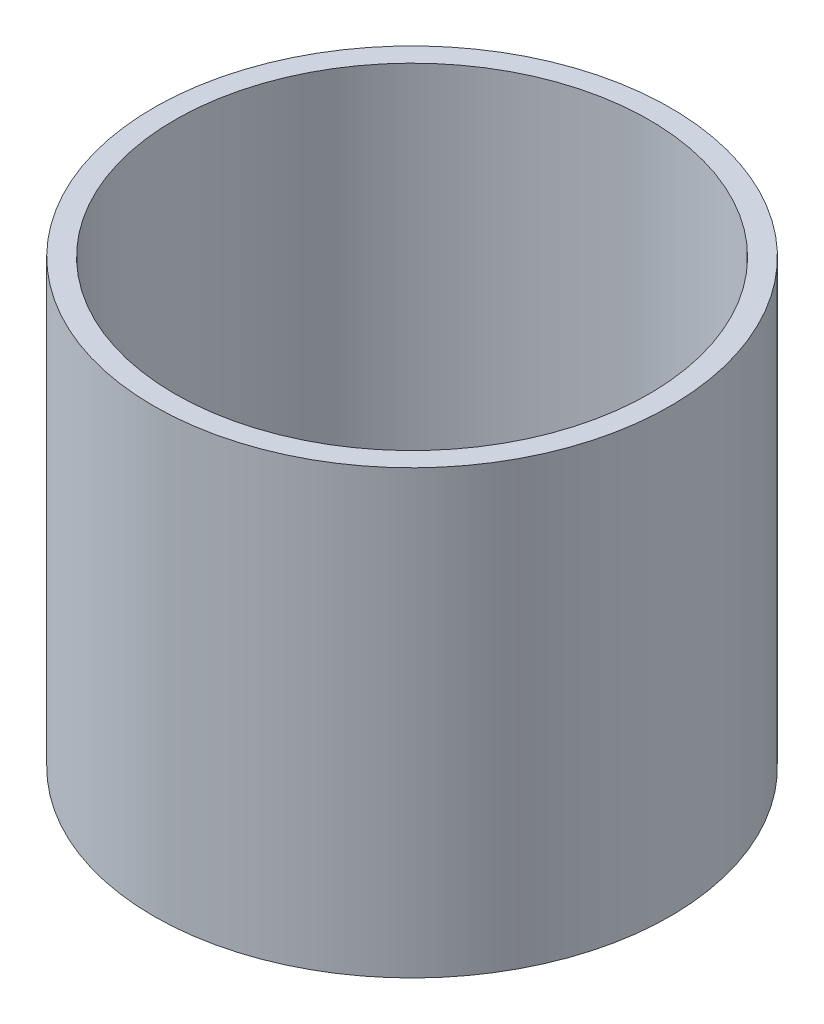
ISO-10303-21;
HEADER;
FILE_DESCRIPTION(('STEP AP214'),'2;1');
FILE_NAME('part.step','',(''),(''),'','','');
FILE_SCHEMA(('AUTOMOTIVE_DESIGN { 1 0 10303 214 1 1 1 1 }'));
ENDSEC;
DATA;
#1=APPLICATION_CONTEXT('core data for automotive mechanical design processes');
#2=APPLICATION_PROTOCOL_DEFINITION('international standard','automotive_design',2000,#1);
#3=PRODUCT_CONTEXT('',#1,'mechanical');
#4=PRODUCT('Part','Part','',(#3));
#5=PRODUCT_RELATED_PRODUCT_CATEGORY('part','',(#4));
#6=PRODUCT_DEFINITION_FORMATION('','',#4);
#7=PRODUCT_DEFINITION_CONTEXT('part definition',#1,'design');
#8=PRODUCT_DEFINITION('design','',#6,#7);
#9=PRODUCT_DEFINITION_SHAPE('','',#8);
#10=(LENGTH_UNIT() NAMED_UNIT(*) SI_UNIT(.MILLI.,.METRE.));
#11=(NAMED_UNIT(*) PLANE_ANGLE_UNIT() SI_UNIT($,.RADIAN.));
#12=(NAMED_UNIT(*) SI_UNIT($,.STERADIAN.) SOLID_ANGLE_UNIT());
#13=UNCERTAINTY_MEASURE_WITH_UNIT(LENGTH_MEASURE(1.E-05),#10,'distance_accuracy_value','');
#14=(GEOMETRIC_REPRESENTATION_CONTEXT(3) GLOBAL_UNCERTAINTY_ASSIGNED_CONTEXT((#13)) GLOBAL_UNIT_ASSIGNED_CONTEXT((#10,
#11,#12)) REPRESENTATION_CONTEXT('',''));
#15=CARTESIAN_POINT('',(0.,0.,0.));
#16=DIRECTION('',(0.,0.,1.));
#17=DIRECTION('',(1.,0.,0.));
#18=AXIS2_PLACEMENT_3D('',#15,#16,#17);
#19=CARTESIAN_POINT('',(0.,41.9,0.));
#20=DIRECTION('',(0.,1.,0.));
#21=DIRECTION('',(0.,0.,1.));
#22=AXIS2_PLACEMENT_3D('',#19,#20,#21);
#23=PLANE('',#22);
#24=CARTESIAN_POINT('',(0.,41.9,0.));
#25=DIRECTION('',(0.,1.,0.));
#26=DIRECTION('',(0.,0.,1.));
#27=AXIS2_PLACEMENT_3D('',#24,#25,#26);
#28=CIRCLE('',#27,24.5);
#29=CARTESIAN_POINT('',(0.,41.9,24.5));
#30=VERTEX_POINT('',#29);
#31=EDGE_CURVE('E10',#30,#30,#28,.T.);
#32=ORIENTED_EDGE('',*,*,#31,.T.);
#33=EDGE_LOOP('',(#32));
#34=FACE_BOUND('',#33,.T.);
#35=CARTESIAN_POINT('',(0.,41.9,0.));
#36=DIRECTION('',(0.,1.,0.));
#37=DIRECTION('',(0.,0.,1.));
#38=AXIS2_PLACEMENT_3D('',#35,#36,#37);
#39=CIRCLE('',#38,22.5);
#40=CARTESIAN_POINT('',(0.,41.9,22.5));
#41=VERTEX_POINT('',#40);
#42=EDGE_CURVE('E41',#41,#41,#39,.T.);
#43=ORIENTED_EDGE('',*,*,#42,.F.);
#44=EDGE_LOOP('',(#43));
#45=FACE_BOUND('',#44,.T.);
#46=ADVANCED_FACE('F30',(#34,#45),#23,.T.);
#47=CARTESIAN_POINT('',(0.,0.,0.));
#48=DIRECTION('',(0.,1.,0.));
#49=DIRECTION('',(0.,0.,1.));
#50=AXIS2_PLACEMENT_3D('',#47,#48,#49);
#51=PLANE('',#50);
#52=CARTESIAN_POINT('',(0.,0.,0.));
#53=DIRECTION('',(0.,1.,0.));
#54=DIRECTION('',(0.,0.,1.));
#55=AXIS2_PLACEMENT_3D('',#52,#53,#54);
#56=CIRCLE('',#55,24.5);
#57=CARTESIAN_POINT('',(0.,0.,24.5));
#58=VERTEX_POINT('',#57);
#59=EDGE_CURVE('E34',#58,#58,#56,.T.);
#60=ORIENTED_EDGE('',*,*,#59,.F.);
#61=EDGE_LOOP('',(#60));
#62=FACE_BOUND('',#61,.T.);
#63=CARTESIAN_POINT('',(0.,0.,0.));
#64=DIRECTION('',(0.,1.,0.));
#65=DIRECTION('',(0.,0.,1.));
#66=AXIS2_PLACEMENT_3D('',#63,#64,#65);
#67=CIRCLE('',#66,22.5);
#68=CARTESIAN_POINT('',(0.,0.,22.5));
#69=VERTEX_POINT('',#68);
#70=EDGE_CURVE('E43',#69,#69,#67,.T.);
#71=ORIENTED_EDGE('',*,*,#70,.T.);
#72=EDGE_LOOP('',(#71));
#73=FACE_BOUND('',#72,.T.);
#74=ADVANCED_FACE('F53',(#62,#73),#51,.F.);
#75=CARTESIAN_POINT('',(0.,41.9,0.));
#76=DIRECTION('',(0.,-1.,0.));
#77=DIRECTION('',(0.,0.,-1.));
#78=AXIS2_PLACEMENT_3D('',#75,#76,#77);
#79=CYLINDRICAL_SURFACE('',#78,24.5);
#80=ORIENTED_EDGE('',*,*,#31,.F.);
#81=EDGE_LOOP('',(#80));
#82=FACE_BOUND('',#81,.T.);
#83=ORIENTED_EDGE('',*,*,#59,.T.);
#84=EDGE_LOOP('',(#83));
#85=FACE_BOUND('',#84,.T.);
#86=ADVANCED_FACE('F32',(#82,#85),#79,.T.);
#87=CARTESIAN_POINT('',(0.,41.9,0.));
#88=DIRECTION('',(0.,-1.,0.));
#89=DIRECTION('',(0.,0.,-1.));
#90=AXIS2_PLACEMENT_3D('',#87,#88,#89);
#91=CYLINDRICAL_SURFACE('',#90,22.5);
#92=ORIENTED_EDGE('',*,*,#42,.T.);
#93=EDGE_LOOP('',(#92));
#94=FACE_BOUND('',#93,.T.);
#95=ORIENTED_EDGE('',*,*,#70,.F.);
#96=EDGE_LOOP('',(#95));
#97=FACE_BOUND('',#96,.T.);
#98=ADVANCED_FACE('F49',(#94,#97),#91,.F.);
#99=CLOSED_SHELL('',(#46,#74,#86,#98));
#100=MANIFOLD_SOLID_BREP('B2',#99);
#101=ADVANCED_BREP_SHAPE_REPRESENTATION('',(#18,#100),#14);
#102=SHAPE_DEFINITION_REPRESENTATION(#9,#101);
ENDSEC;
END-ISO-10303-21;
